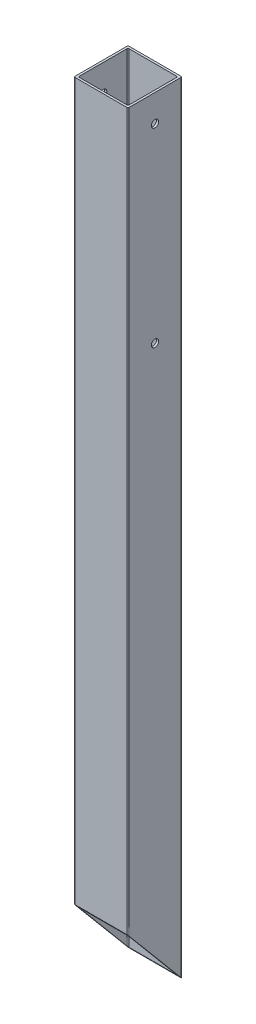
ISO-10303-21;
HEADER;
FILE_DESCRIPTION(('STEP AP214'),'2;1');
FILE_NAME('part.step','',(''),(''),'','','');
FILE_SCHEMA(('AUTOMOTIVE_DESIGN { 1 0 10303 214 1 1 1 1 }'));
ENDSEC;
DATA;
#1=APPLICATION_CONTEXT('core data for automotive mechanical design processes');
#2=APPLICATION_PROTOCOL_DEFINITION('international standard','automotive_design',2000,#1);
#3=PRODUCT_CONTEXT('',#1,'mechanical');
#4=PRODUCT('Part','Part','',(#3));
#5=PRODUCT_RELATED_PRODUCT_CATEGORY('part','',(#4));
#6=PRODUCT_DEFINITION_FORMATION('','',#4);
#7=PRODUCT_DEFINITION_CONTEXT('part definition',#1,'design');
#8=PRODUCT_DEFINITION('design','',#6,#7);
#9=PRODUCT_DEFINITION_SHAPE('','',#8);
#10=(LENGTH_UNIT() NAMED_UNIT(*) SI_UNIT(.MILLI.,.METRE.));
#11=(NAMED_UNIT(*) PLANE_ANGLE_UNIT() SI_UNIT($,.RADIAN.));
#12=(NAMED_UNIT(*) SI_UNIT($,.STERADIAN.) SOLID_ANGLE_UNIT());
#13=UNCERTAINTY_MEASURE_WITH_UNIT(LENGTH_MEASURE(1.E-05),#10,'distance_accuracy_value','');
#14=(GEOMETRIC_REPRESENTATION_CONTEXT(3) GLOBAL_UNCERTAINTY_ASSIGNED_CONTEXT((#13)) GLOBAL_UNIT_ASSIGNED_CONTEXT((#10,
#11,#12)) REPRESENTATION_CONTEXT('',''));
#15=CARTESIAN_POINT('',(0.,0.,0.));
#16=DIRECTION('',(0.,0.,1.));
#17=DIRECTION('',(1.,0.,0.));
#18=AXIS2_PLACEMENT_3D('',#15,#16,#17);
#19=CARTESIAN_POINT('',(2.,1500.,-2.));
#20=DIRECTION('',(0.,1.,0.));
#21=DIRECTION('',(0.,0.,1.));
#22=AXIS2_PLACEMENT_3D('',#19,#20,#21);
#23=PLANE('',#22);
#24=CARTESIAN_POINT('',(2.,1500.,-2.));
#25=DIRECTION('',(0.,1.,0.));
#26=DIRECTION('',(0.,0.,1.));
#27=AXIS2_PLACEMENT_3D('',#24,#25,#26);
#28=CIRCLE('',#27,2.);
#29=CARTESIAN_POINT('',(0.,1500.,-2.00000000000001));
#30=VERTEX_POINT('',#29);
#31=CARTESIAN_POINT('',(2.00000000000001,1500.,0.));
#32=VERTEX_POINT('',#31);
#33=EDGE_CURVE('E257',#30,#32,#28,.T.);
#34=ORIENTED_EDGE('',*,*,#33,.T.);
#35=DIRECTION('',(1.,0.,0.));
#36=VECTOR('',#35,1.);
#37=CARTESIAN_POINT('',(2.00000000000001,1500.,0.));
#38=LINE('',#37,#36);
#39=CARTESIAN_POINT('',(98.,1500.,0.));
#40=VERTEX_POINT('',#39);
#41=EDGE_CURVE('E260',#32,#40,#38,.T.);
#42=ORIENTED_EDGE('',*,*,#41,.T.);
#43=CARTESIAN_POINT('',(98.,1500.,-2.));
#44=DIRECTION('',(0.,1.,0.));
#45=DIRECTION('',(0.,0.,1.));
#46=AXIS2_PLACEMENT_3D('',#43,#44,#45);
#47=CIRCLE('',#46,2.);
#48=CARTESIAN_POINT('',(100.,1500.,-2.00000000000001));
#49=VERTEX_POINT('',#48);
#50=EDGE_CURVE('E262',#40,#49,#47,.T.);
#51=ORIENTED_EDGE('',*,*,#50,.T.);
#52=DIRECTION('',(0.,0.,-1.));
#53=VECTOR('',#52,1.);
#54=CARTESIAN_POINT('',(100.,1500.,-2.00000000000001));
#55=LINE('',#54,#53);
#56=CARTESIAN_POINT('',(100.,1500.,-98.));
#57=VERTEX_POINT('',#56);
#58=EDGE_CURVE('E264',#49,#57,#55,.T.);
#59=ORIENTED_EDGE('',*,*,#58,.T.);
#60=CARTESIAN_POINT('',(98.,1500.,-98.));
#61=DIRECTION('',(0.,1.,0.));
#62=DIRECTION('',(0.,0.,1.));
#63=AXIS2_PLACEMENT_3D('',#60,#61,#62);
#64=CIRCLE('',#63,2.);
#65=CARTESIAN_POINT('',(98.,1500.,-100.));
#66=VERTEX_POINT('',#65);
#67=EDGE_CURVE('E266',#57,#66,#64,.T.);
#68=ORIENTED_EDGE('',*,*,#67,.T.);
#69=DIRECTION('',(-1.,0.,0.));
#70=VECTOR('',#69,1.);
#71=CARTESIAN_POINT('',(2.00000000000001,1500.,-100.));
#72=LINE('',#71,#70);
#73=CARTESIAN_POINT('',(2.00000000000001,1500.,-100.));
#74=VERTEX_POINT('',#73);
#75=EDGE_CURVE('E268',#66,#74,#72,.T.);
#76=ORIENTED_EDGE('',*,*,#75,.T.);
#77=CARTESIAN_POINT('',(2.,1500.,-98.));
#78=DIRECTION('',(0.,1.,0.));
#79=DIRECTION('',(0.,0.,1.));
#80=AXIS2_PLACEMENT_3D('',#77,#78,#79);
#81=CIRCLE('',#80,2.);
#82=CARTESIAN_POINT('',(0.,1500.,-98.));
#83=VERTEX_POINT('',#82);
#84=EDGE_CURVE('E270',#74,#83,#81,.T.);
#85=ORIENTED_EDGE('',*,*,#84,.T.);
#86=DIRECTION('',(0.,0.,1.));
#87=VECTOR('',#86,1.);
#88=CARTESIAN_POINT('',(0.,1500.,-2.00000000000001));
#89=LINE('',#88,#87);
#90=EDGE_CURVE('E166',#83,#30,#89,.T.);
#91=ORIENTED_EDGE('',*,*,#90,.T.);
#92=EDGE_LOOP('',(#34,#42,#51,#59,#68,#76,#85,#91));
#93=FACE_BOUND('',#92,.T.);
#94=DIRECTION('',(0.,0.,1.));
#95=VECTOR('',#94,1.);
#96=CARTESIAN_POINT('',(4.,1500.,-6.00000000000001));
#97=LINE('',#96,#95);
#98=CARTESIAN_POINT('',(4.,1500.,-94.));
#99=VERTEX_POINT('',#98);
#100=CARTESIAN_POINT('',(4.,1500.,-6.00000000000001));
#101=VERTEX_POINT('',#100);
#102=EDGE_CURVE('E218',#99,#101,#97,.T.);
#103=ORIENTED_EDGE('',*,*,#102,.F.);
#104=CARTESIAN_POINT('',(6.,1500.,-94.));
#105=DIRECTION('',(0.,1.,0.));
#106=DIRECTION('',(0.,0.,-1.));
#107=AXIS2_PLACEMENT_3D('',#104,#105,#106);
#108=CIRCLE('',#107,2.);
#109=CARTESIAN_POINT('',(6.00000000000001,1500.,-96.));
#110=VERTEX_POINT('',#109);
#111=EDGE_CURVE('E216',#110,#99,#108,.T.);
#112=ORIENTED_EDGE('',*,*,#111,.F.);
#113=DIRECTION('',(-1.,0.,0.));
#114=VECTOR('',#113,1.);
#115=CARTESIAN_POINT('',(6.00000000000001,1500.,-96.));
#116=LINE('',#115,#114);
#117=CARTESIAN_POINT('',(94.,1500.,-96.));
#118=VERTEX_POINT('',#117);
#119=EDGE_CURVE('E231',#118,#110,#116,.T.);
#120=ORIENTED_EDGE('',*,*,#119,.F.);
#121=CARTESIAN_POINT('',(94.,1500.,-94.));
#122=DIRECTION('',(0.,1.,0.));
#123=DIRECTION('',(0.,0.,1.));
#124=AXIS2_PLACEMENT_3D('',#121,#122,#123);
#125=CIRCLE('',#124,2.);
#126=CARTESIAN_POINT('',(96.,1500.,-94.));
#127=VERTEX_POINT('',#126);
#128=EDGE_CURVE('E228',#127,#118,#125,.T.);
#129=ORIENTED_EDGE('',*,*,#128,.F.);
#130=DIRECTION('',(0.,0.,-1.));
#131=VECTOR('',#130,1.);
#132=CARTESIAN_POINT('',(96.,1500.,-6.00000000000001));
#133=LINE('',#132,#131);
#134=CARTESIAN_POINT('',(96.,1500.,-6.00000000000001));
#135=VERTEX_POINT('',#134);
#136=EDGE_CURVE('E226',#135,#127,#133,.T.);
#137=ORIENTED_EDGE('',*,*,#136,.F.);
#138=CARTESIAN_POINT('',(94.,1500.,-6.));
#139=DIRECTION('',(0.,1.,0.));
#140=DIRECTION('',(0.,0.,-1.));
#141=AXIS2_PLACEMENT_3D('',#138,#139,#140);
#142=CIRCLE('',#141,2.);
#143=CARTESIAN_POINT('',(94.,1500.,-4.));
#144=VERTEX_POINT('',#143);
#145=EDGE_CURVE('E224',#144,#135,#142,.T.);
#146=ORIENTED_EDGE('',*,*,#145,.F.);
#147=DIRECTION('',(1.,0.,0.));
#148=VECTOR('',#147,1.);
#149=CARTESIAN_POINT('',(6.00000000000001,1500.,-4.));
#150=LINE('',#149,#148);
#151=CARTESIAN_POINT('',(6.00000000000001,1500.,-4.));
#152=VERTEX_POINT('',#151);
#153=EDGE_CURVE('E222',#152,#144,#150,.T.);
#154=ORIENTED_EDGE('',*,*,#153,.F.);
#155=CARTESIAN_POINT('',(6.,1500.,-6.));
#156=DIRECTION('',(0.,1.,0.));
#157=DIRECTION('',(0.,0.,-1.));
#158=AXIS2_PLACEMENT_3D('',#155,#156,#157);
#159=CIRCLE('',#158,2.);
#160=EDGE_CURVE('E220',#101,#152,#159,.T.);
#161=ORIENTED_EDGE('',*,*,#160,.F.);
#162=EDGE_LOOP('',(#103,#112,#120,#129,#137,#146,#154,#161));
#163=FACE_BOUND('',#162,.T.);
#164=ADVANCED_FACE('F33',(#93,#163),#23,.T.);
#165=CARTESIAN_POINT('',(2.,1500.,-2.));
#166=DIRECTION('',(0.,-1.,0.));
#167=DIRECTION('',(0.,0.,-1.));
#168=AXIS2_PLACEMENT_3D('',#165,#166,#167);
#169=CYLINDRICAL_SURFACE('',#168,2.);
#170=DIRECTION('',(0.,-1.,0.));
#171=VECTOR('',#170,1.);
#172=CARTESIAN_POINT('',(0.,1500.,-2.00000000000001));
#173=LINE('',#172,#171);
#174=CARTESIAN_POINT('',(0.,171.616492814812,-1.99999999999995));
#175=VERTEX_POINT('',#174);
#176=EDGE_CURVE('E167',#30,#175,#173,.T.);
#177=ORIENTED_EDGE('',*,*,#176,.T.);
#178=CARTESIAN_POINT('',(2.,171.616492814812,-2.));
#179=DIRECTION('',(0.,0.64278760968654,-0.766044443118977));
#180=DIRECTION('',(0.,-0.766044443118977,-0.64278760968654));
#181=AXIS2_PLACEMENT_3D('',#178,#179,#180);
#182=ELLIPSE('',#181,3.11144765372082,2.);
#183=CARTESIAN_POINT('',(2.00000000000002,174.,0.));
#184=VERTEX_POINT('',#183);
#185=EDGE_CURVE('E48',#175,#184,#182,.T.);
#186=ORIENTED_EDGE('',*,*,#185,.T.);
#187=DIRECTION('',(0.,-1.,0.));
#188=VECTOR('',#187,1.);
#189=CARTESIAN_POINT('',(2.00000000000001,1500.,0.));
#190=LINE('',#189,#188);
#191=EDGE_CURVE('E41',#32,#184,#190,.T.);
#192=ORIENTED_EDGE('',*,*,#191,.F.);
#193=ORIENTED_EDGE('',*,*,#33,.F.);
#194=EDGE_LOOP('',(#177,#186,#192,#193));
#195=FACE_BOUND('',#194,.T.);
#196=ADVANCED_FACE('F35',(#195),#169,.T.);
#197=CARTESIAN_POINT('',(2.00000000000001,1500.,0.));
#198=DIRECTION('',(0.,0.,-1.));
#199=DIRECTION('',(-1.,0.,0.));
#200=AXIS2_PLACEMENT_3D('',#197,#198,#199);
#201=PLANE('',#200);
#202=ORIENTED_EDGE('',*,*,#191,.T.);
#203=DIRECTION('',(-1.,0.,0.));
#204=VECTOR('',#203,1.);
#205=CARTESIAN_POINT('',(100.,174.,0.));
#206=LINE('',#205,#204);
#207=CARTESIAN_POINT('',(98.,174.,0.));
#208=VERTEX_POINT('',#207);
#209=EDGE_CURVE('E280',#208,#184,#206,.T.);
#210=ORIENTED_EDGE('',*,*,#209,.F.);
#211=DIRECTION('',(0.,-1.,0.));
#212=VECTOR('',#211,1.);
#213=CARTESIAN_POINT('',(98.,1500.,0.));
#214=LINE('',#213,#212);
#215=EDGE_CURVE('E182',#40,#208,#214,.T.);
#216=ORIENTED_EDGE('',*,*,#215,.F.);
#217=ORIENTED_EDGE('',*,*,#41,.F.);
#218=EDGE_LOOP('',(#202,#210,#216,#217));
#219=FACE_BOUND('',#218,.T.);
#220=ADVANCED_FACE('F278',(#219),#201,.F.);
#221=CARTESIAN_POINT('',(98.,1500.,-2.));
#222=DIRECTION('',(0.,-1.,0.));
#223=DIRECTION('',(0.,0.,-1.));
#224=AXIS2_PLACEMENT_3D('',#221,#222,#223);
#225=CYLINDRICAL_SURFACE('',#224,2.);
#226=ORIENTED_EDGE('',*,*,#215,.T.);
#227=CARTESIAN_POINT('',(98.,171.616492814812,-2.));
#228=DIRECTION('',(0.,0.64278760968654,-0.766044443118977));
#229=DIRECTION('',(0.,-0.766044443118977,-0.64278760968654));
#230=AXIS2_PLACEMENT_3D('',#227,#228,#229);
#231=ELLIPSE('',#230,3.11144765372082,2.);
#232=CARTESIAN_POINT('',(100.,171.616492814812,-1.99999999999991));
#233=VERTEX_POINT('',#232);
#234=EDGE_CURVE('E288',#208,#233,#231,.T.);
#235=ORIENTED_EDGE('',*,*,#234,.T.);
#236=DIRECTION('',(0.,-1.,0.));
#237=VECTOR('',#236,1.);
#238=CARTESIAN_POINT('',(100.,1500.,-2.00000000000001));
#239=LINE('',#238,#237);
#240=EDGE_CURVE('E179',#49,#233,#239,.T.);
#241=ORIENTED_EDGE('',*,*,#240,.F.);
#242=ORIENTED_EDGE('',*,*,#50,.F.);
#243=EDGE_LOOP('',(#226,#235,#241,#242));
#244=FACE_BOUND('',#243,.T.);
#245=ADVANCED_FACE('F287',(#244),#225,.T.);
#246=CARTESIAN_POINT('',(100.,1500.,-2.00000000000001));
#247=DIRECTION('',(-1.,0.,0.));
#248=DIRECTION('',(0.,0.,1.));
#249=AXIS2_PLACEMENT_3D('',#246,#247,#248);
#250=PLANE('',#249);
#251=CARTESIAN_POINT('',(100.,1098.,-50.));
#252=DIRECTION('',(-1.,0.,0.));
#253=DIRECTION('',(0.,0.,1.));
#254=AXIS2_PLACEMENT_3D('',#251,#252,#253);
#255=CIRCLE('',#254,6.74999999999992);
#256=CARTESIAN_POINT('',(100.,1098.,-43.2500000000001));
#257=VERTEX_POINT('',#256);
#258=EDGE_CURVE('E194',#257,#257,#255,.T.);
#259=ORIENTED_EDGE('',*,*,#258,.T.);
#260=EDGE_LOOP('',(#259));
#261=FACE_BOUND('',#260,.T.);
#262=CARTESIAN_POINT('',(100.,1450.,-50.0000000000001));
#263=DIRECTION('',(-1.,0.,0.));
#264=DIRECTION('',(0.,0.,1.));
#265=AXIS2_PLACEMENT_3D('',#262,#263,#264);
#266=CIRCLE('',#265,6.74999999999993);
#267=CARTESIAN_POINT('',(100.,1450.,-43.2500000000001));
#268=VERTEX_POINT('',#267);
#269=EDGE_CURVE('E190',#268,#268,#266,.T.);
#270=ORIENTED_EDGE('',*,*,#269,.T.);
#271=EDGE_LOOP('',(#270));
#272=FACE_BOUND('',#271,.T.);
#273=ORIENTED_EDGE('',*,*,#240,.T.);
#274=DIRECTION('',(0.,-0.766044443118977,-0.64278760968654));
#275=VECTOR('',#274,1.);
#276=CARTESIAN_POINT('',(100.,174.,0.));
#277=LINE('',#276,#275);
#278=CARTESIAN_POINT('',(100.,57.2081479257678,-98.));
#279=VERTEX_POINT('',#278);
#280=EDGE_CURVE('E151',#233,#279,#277,.T.);
#281=ORIENTED_EDGE('',*,*,#280,.T.);
#282=DIRECTION('',(0.,-1.,0.));
#283=VECTOR('',#282,1.);
#284=CARTESIAN_POINT('',(100.,1500.,-98.));
#285=LINE('',#284,#283);
#286=EDGE_CURVE('E176',#57,#279,#285,.T.);
#287=ORIENTED_EDGE('',*,*,#286,.F.);
#288=ORIENTED_EDGE('',*,*,#58,.F.);
#289=EDGE_LOOP('',(#273,#281,#287,#288));
#290=FACE_BOUND('',#289,.T.);
#291=ADVANCED_FACE('F291',(#261,#272,#290),#250,.F.);
#292=CARTESIAN_POINT('',(98.,1500.,-98.));
#293=DIRECTION('',(0.,-1.,0.));
#294=DIRECTION('',(0.,0.,-1.));
#295=AXIS2_PLACEMENT_3D('',#292,#293,#294);
#296=CYLINDRICAL_SURFACE('',#295,2.);
#297=ORIENTED_EDGE('',*,*,#286,.T.);
#298=CARTESIAN_POINT('',(98.,57.2081479257676,-98.));
#299=DIRECTION('',(0.,0.64278760968654,-0.766044443118977));
#300=DIRECTION('',(0.,-0.766044443118977,-0.64278760968654));
#301=AXIS2_PLACEMENT_3D('',#298,#299,#300);
#302=ELLIPSE('',#301,3.11144765372082,2.);
#303=CARTESIAN_POINT('',(98.,54.8246407405792,-100.));
#304=VERTEX_POINT('',#303);
#305=EDGE_CURVE('E300',#279,#304,#302,.T.);
#306=ORIENTED_EDGE('',*,*,#305,.T.);
#307=DIRECTION('',(0.,-1.,0.));
#308=VECTOR('',#307,1.);
#309=CARTESIAN_POINT('',(98.,1500.,-100.));
#310=LINE('',#309,#308);
#311=EDGE_CURVE('E169',#66,#304,#310,.T.);
#312=ORIENTED_EDGE('',*,*,#311,.F.);
#313=ORIENTED_EDGE('',*,*,#67,.F.);
#314=EDGE_LOOP('',(#297,#306,#312,#313));
#315=FACE_BOUND('',#314,.T.);
#316=ADVANCED_FACE('F296',(#315),#296,.T.);
#317=CARTESIAN_POINT('',(2.00000000000001,1500.,-100.));
#318=DIRECTION('',(0.,0.,1.));
#319=DIRECTION('',(1.,0.,0.));
#320=AXIS2_PLACEMENT_3D('',#317,#318,#319);
#321=PLANE('',#320);
#322=ORIENTED_EDGE('',*,*,#311,.T.);
#323=DIRECTION('',(-1.,0.,0.));
#324=VECTOR('',#323,1.);
#325=CARTESIAN_POINT('',(2.00000000000001,54.8246407405792,-100.));
#326=LINE('',#325,#324);
#327=CARTESIAN_POINT('',(2.00000000000001,54.8246407405792,-100.));
#328=VERTEX_POINT('',#327);
#329=EDGE_CURVE('E162',#304,#328,#326,.T.);
#330=ORIENTED_EDGE('',*,*,#329,.T.);
#331=DIRECTION('',(0.,-1.,0.));
#332=VECTOR('',#331,1.);
#333=CARTESIAN_POINT('',(2.00000000000001,1500.,-100.));
#334=LINE('',#333,#332);
#335=EDGE_CURVE('E161',#74,#328,#334,.T.);
#336=ORIENTED_EDGE('',*,*,#335,.F.);
#337=ORIENTED_EDGE('',*,*,#75,.F.);
#338=EDGE_LOOP('',(#322,#330,#336,#337));
#339=FACE_BOUND('',#338,.T.);
#340=ADVANCED_FACE('F299',(#339),#321,.F.);
#341=CARTESIAN_POINT('',(2.,1500.,-98.));
#342=DIRECTION('',(0.,-1.,0.));
#343=DIRECTION('',(0.,0.,-1.));
#344=AXIS2_PLACEMENT_3D('',#341,#342,#343);
#345=CYLINDRICAL_SURFACE('',#344,2.);
#346=ORIENTED_EDGE('',*,*,#335,.T.);
#347=CARTESIAN_POINT('',(2.,57.2081479257676,-98.));
#348=DIRECTION('',(0.,0.64278760968654,-0.766044443118977));
#349=DIRECTION('',(0.,-0.766044443118977,-0.64278760968654));
#350=AXIS2_PLACEMENT_3D('',#347,#348,#349);
#351=ELLIPSE('',#350,3.11144765372082,2.);
#352=CARTESIAN_POINT('',(0.,57.2081479257675,-98.0000000000002));
#353=VERTEX_POINT('',#352);
#354=EDGE_CURVE('E145',#328,#353,#351,.T.);
#355=ORIENTED_EDGE('',*,*,#354,.T.);
#356=DIRECTION('',(0.,-1.,0.));
#357=VECTOR('',#356,1.);
#358=CARTESIAN_POINT('',(0.,1500.,-98.));
#359=LINE('',#358,#357);
#360=EDGE_CURVE('E158',#83,#353,#359,.T.);
#361=ORIENTED_EDGE('',*,*,#360,.F.);
#362=ORIENTED_EDGE('',*,*,#84,.F.);
#363=EDGE_LOOP('',(#346,#355,#361,#362));
#364=FACE_BOUND('',#363,.T.);
#365=ADVANCED_FACE('F156',(#364),#345,.T.);
#366=CARTESIAN_POINT('',(0.,1500.,-2.00000000000001));
#367=DIRECTION('',(1.,0.,0.));
#368=DIRECTION('',(0.,0.,-1.));
#369=AXIS2_PLACEMENT_3D('',#366,#367,#368);
#370=PLANE('',#369);
#371=CARTESIAN_POINT('',(0.,1098.,-50.));
#372=DIRECTION('',(-1.,0.,0.));
#373=DIRECTION('',(0.,0.,1.));
#374=AXIS2_PLACEMENT_3D('',#371,#372,#373);
#375=CIRCLE('',#374,6.74999999999992);
#376=CARTESIAN_POINT('',(0.,1098.,-43.2500000000001));
#377=VERTEX_POINT('',#376);
#378=EDGE_CURVE('E201',#377,#377,#375,.T.);
#379=ORIENTED_EDGE('',*,*,#378,.F.);
#380=EDGE_LOOP('',(#379));
#381=FACE_BOUND('',#380,.T.);
#382=CARTESIAN_POINT('',(0.,1450.,-50.0000000000001));
#383=DIRECTION('',(-1.,0.,0.));
#384=DIRECTION('',(0.,0.,1.));
#385=AXIS2_PLACEMENT_3D('',#382,#383,#384);
#386=CIRCLE('',#385,6.74999999999993);
#387=CARTESIAN_POINT('',(0.,1450.,-43.2500000000001));
#388=VERTEX_POINT('',#387);
#389=EDGE_CURVE('E198',#388,#388,#386,.T.);
#390=ORIENTED_EDGE('',*,*,#389,.F.);
#391=EDGE_LOOP('',(#390));
#392=FACE_BOUND('',#391,.T.);
#393=ORIENTED_EDGE('',*,*,#360,.T.);
#394=DIRECTION('',(0.,-0.766044443118977,-0.64278760968654));
#395=VECTOR('',#394,1.);
#396=CARTESIAN_POINT('',(0.,174.,0.));
#397=LINE('',#396,#395);
#398=EDGE_CURVE('E142',#175,#353,#397,.T.);
#399=ORIENTED_EDGE('',*,*,#398,.F.);
#400=ORIENTED_EDGE('',*,*,#176,.F.);
#401=ORIENTED_EDGE('',*,*,#90,.F.);
#402=EDGE_LOOP('',(#393,#399,#400,#401));
#403=FACE_BOUND('',#402,.T.);
#404=ADVANCED_FACE('F165',(#381,#392,#403),#370,.F.);
#405=CARTESIAN_POINT('',(6.,1500.,-94.));
#406=DIRECTION('',(0.,-1.,0.));
#407=DIRECTION('',(0.,0.,-1.));
#408=AXIS2_PLACEMENT_3D('',#405,#406,#407);
#409=CYLINDRICAL_SURFACE('',#408,2.);
#410=CARTESIAN_POINT('',(6.,61.9751622961444,-94.));
#411=DIRECTION('',(0.,0.64278760968654,-0.766044443118977));
#412=DIRECTION('',(0.,-0.766044443118977,-0.64278760968654));
#413=AXIS2_PLACEMENT_3D('',#410,#411,#412);
#414=ELLIPSE('',#413,3.11144765372082,2.);
#415=CARTESIAN_POINT('',(6.00000000000001,59.5916551109561,-96.));
#416=VERTEX_POINT('',#415);
#417=CARTESIAN_POINT('',(4.,61.9751622961444,-94.0000000000001));
#418=VERTEX_POINT('',#417);
#419=EDGE_CURVE('E163',#416,#418,#414,.T.);
#420=ORIENTED_EDGE('',*,*,#419,.F.);
#421=DIRECTION('',(0.,-1.,0.));
#422=VECTOR('',#421,1.);
#423=CARTESIAN_POINT('',(6.00000000000001,1500.,-96.));
#424=LINE('',#423,#422);
#425=EDGE_CURVE('E233',#110,#416,#424,.T.);
#426=ORIENTED_EDGE('',*,*,#425,.F.);
#427=ORIENTED_EDGE('',*,*,#111,.T.);
#428=DIRECTION('',(0.,-1.,0.));
#429=VECTOR('',#428,1.);
#430=CARTESIAN_POINT('',(4.,1500.,-94.));
#431=LINE('',#430,#429);
#432=EDGE_CURVE('E254',#99,#418,#431,.T.);
#433=ORIENTED_EDGE('',*,*,#432,.T.);
#434=EDGE_LOOP('',(#420,#426,#427,#433));
#435=FACE_BOUND('',#434,.T.);
#436=ADVANCED_FACE('F338',(#435),#409,.F.);
#437=CARTESIAN_POINT('',(4.,1500.,-6.00000000000001));
#438=DIRECTION('',(1.,0.,0.));
#439=DIRECTION('',(0.,0.,-1.));
#440=AXIS2_PLACEMENT_3D('',#437,#438,#439);
#441=PLANE('',#440);
#442=DIRECTION('',(0.,0.766044443118977,0.64278760968654));
#443=VECTOR('',#442,1.);
#444=CARTESIAN_POINT('',(4.,949.174318534136,650.448484780095));
#445=LINE('',#444,#443);
#446=CARTESIAN_POINT('',(4.,166.849478444435,-6.00000000000001));
#447=VERTEX_POINT('',#446);
#448=EDGE_CURVE('E305',#418,#447,#445,.T.);
#449=ORIENTED_EDGE('',*,*,#448,.F.);
#450=ORIENTED_EDGE('',*,*,#432,.F.);
#451=ORIENTED_EDGE('',*,*,#102,.T.);
#452=DIRECTION('',(0.,-1.,0.));
#453=VECTOR('',#452,1.);
#454=CARTESIAN_POINT('',(4.,1500.,-6.00000000000001));
#455=LINE('',#454,#453);
#456=EDGE_CURVE('E251',#101,#447,#455,.T.);
#457=ORIENTED_EDGE('',*,*,#456,.T.);
#458=EDGE_LOOP('',(#449,#450,#451,#457));
#459=FACE_BOUND('',#458,.T.);
#460=CARTESIAN_POINT('',(4.,1098.,-50.));
#461=DIRECTION('',(1.,0.,0.));
#462=DIRECTION('',(0.,0.,-1.));
#463=AXIS2_PLACEMENT_3D('',#460,#461,#462);
#464=CIRCLE('',#463,6.74999999999992);
#465=CARTESIAN_POINT('',(4.,1098.,-56.7499999999999));
#466=VERTEX_POINT('',#465);
#467=EDGE_CURVE('E193',#466,#466,#464,.T.);
#468=ORIENTED_EDGE('',*,*,#467,.F.);
#469=EDGE_LOOP('',(#468));
#470=FACE_BOUND('',#469,.T.);
#471=CARTESIAN_POINT('',(4.,1450.,-50.0000000000001));
#472=DIRECTION('',(1.,0.,0.));
#473=DIRECTION('',(0.,0.,-1.));
#474=AXIS2_PLACEMENT_3D('',#471,#472,#473);
#475=CIRCLE('',#474,6.74999999999993);
#476=CARTESIAN_POINT('',(4.,1450.,-56.75));
#477=VERTEX_POINT('',#476);
#478=EDGE_CURVE('E189',#477,#477,#475,.T.);
#479=ORIENTED_EDGE('',*,*,#478,.F.);
#480=EDGE_LOOP('',(#479));
#481=FACE_BOUND('',#480,.T.);
#482=ADVANCED_FACE('F343',(#459,#470,#481),#441,.T.);
#483=CARTESIAN_POINT('',(6.,1500.,-6.));
#484=DIRECTION('',(0.,-1.,0.));
#485=DIRECTION('',(0.,0.,-1.));
#486=AXIS2_PLACEMENT_3D('',#483,#484,#485);
#487=CYLINDRICAL_SURFACE('',#486,2.);
#488=CARTESIAN_POINT('',(6.,166.849478444435,-6.));
#489=DIRECTION('',(0.,0.64278760968654,-0.766044443118977));
#490=DIRECTION('',(0.,-0.766044443118977,-0.64278760968654));
#491=AXIS2_PLACEMENT_3D('',#488,#489,#490);
#492=ELLIPSE('',#491,3.11144765372082,2.);
#493=CARTESIAN_POINT('',(6.00000000000001,169.232985629623,-4.));
#494=VERTEX_POINT('',#493);
#495=EDGE_CURVE('E307',#447,#494,#492,.T.);
#496=ORIENTED_EDGE('',*,*,#495,.F.);
#497=ORIENTED_EDGE('',*,*,#456,.F.);
#498=ORIENTED_EDGE('',*,*,#160,.T.);
#499=DIRECTION('',(0.,-1.,0.));
#500=VECTOR('',#499,1.);
#501=CARTESIAN_POINT('',(6.00000000000001,1500.,-4.));
#502=LINE('',#501,#500);
#503=EDGE_CURVE('E248',#152,#494,#502,.T.);
#504=ORIENTED_EDGE('',*,*,#503,.T.);
#505=EDGE_LOOP('',(#496,#497,#498,#504));
#506=FACE_BOUND('',#505,.T.);
#507=ADVANCED_FACE('F348',(#506),#487,.F.);
#508=CARTESIAN_POINT('',(6.00000000000001,1500.,-4.));
#509=DIRECTION('',(0.,0.,-1.));
#510=DIRECTION('',(-1.,0.,0.));
#511=AXIS2_PLACEMENT_3D('',#508,#509,#510);
#512=PLANE('',#511);
#513=DIRECTION('',(1.,0.,0.));
#514=VECTOR('',#513,1.);
#515=CARTESIAN_POINT('',(6.00000000000001,169.232985629623,-4.));
#516=LINE('',#515,#514);
#517=CARTESIAN_POINT('',(94.,169.232985629623,-4.));
#518=VERTEX_POINT('',#517);
#519=EDGE_CURVE('E309',#494,#518,#516,.T.);
#520=ORIENTED_EDGE('',*,*,#519,.F.);
#521=ORIENTED_EDGE('',*,*,#503,.F.);
#522=ORIENTED_EDGE('',*,*,#153,.T.);
#523=DIRECTION('',(0.,-1.,0.));
#524=VECTOR('',#523,1.);
#525=CARTESIAN_POINT('',(94.,1500.,-4.));
#526=LINE('',#525,#524);
#527=EDGE_CURVE('E245',#144,#518,#526,.T.);
#528=ORIENTED_EDGE('',*,*,#527,.T.);
#529=EDGE_LOOP('',(#520,#521,#522,#528));
#530=FACE_BOUND('',#529,.T.);
#531=ADVANCED_FACE('F353',(#530),#512,.T.);
#532=CARTESIAN_POINT('',(94.,1500.,-6.));
#533=DIRECTION('',(0.,-1.,0.));
#534=DIRECTION('',(0.,0.,-1.));
#535=AXIS2_PLACEMENT_3D('',#532,#533,#534);
#536=CYLINDRICAL_SURFACE('',#535,2.);
#537=CARTESIAN_POINT('',(94.,166.849478444435,-6.));
#538=DIRECTION('',(0.,0.64278760968654,-0.766044443118977));
#539=DIRECTION('',(0.,-0.766044443118977,-0.64278760968654));
#540=AXIS2_PLACEMENT_3D('',#537,#538,#539);
#541=ELLIPSE('',#540,3.11144765372082,2.);
#542=CARTESIAN_POINT('',(96.,166.849478444435,-5.99999999999989));
#543=VERTEX_POINT('',#542);
#544=EDGE_CURVE('E311',#518,#543,#541,.T.);
#545=ORIENTED_EDGE('',*,*,#544,.F.);
#546=ORIENTED_EDGE('',*,*,#527,.F.);
#547=ORIENTED_EDGE('',*,*,#145,.T.);
#548=DIRECTION('',(0.,-1.,0.));
#549=VECTOR('',#548,1.);
#550=CARTESIAN_POINT('',(96.,1500.,-6.00000000000001));
#551=LINE('',#550,#549);
#552=EDGE_CURVE('E242',#135,#543,#551,.T.);
#553=ORIENTED_EDGE('',*,*,#552,.T.);
#554=EDGE_LOOP('',(#545,#546,#547,#553));
#555=FACE_BOUND('',#554,.T.);
#556=ADVANCED_FACE('F355',(#555),#536,.F.);
#557=CARTESIAN_POINT('',(96.,1500.,-6.00000000000001));
#558=DIRECTION('',(-1.,0.,0.));
#559=DIRECTION('',(0.,0.,1.));
#560=AXIS2_PLACEMENT_3D('',#557,#558,#559);
#561=PLANE('',#560);
#562=DIRECTION('',(0.,-0.766044443118977,-0.64278760968654));
#563=VECTOR('',#562,1.);
#564=CARTESIAN_POINT('',(96.,949.174318534136,650.448484780095));
#565=LINE('',#564,#563);
#566=CARTESIAN_POINT('',(96.,61.9751622961444,-94.));
#567=VERTEX_POINT('',#566);
#568=EDGE_CURVE('E313',#543,#567,#565,.T.);
#569=ORIENTED_EDGE('',*,*,#568,.F.);
#570=ORIENTED_EDGE('',*,*,#552,.F.);
#571=ORIENTED_EDGE('',*,*,#136,.T.);
#572=DIRECTION('',(0.,-1.,0.));
#573=VECTOR('',#572,1.);
#574=CARTESIAN_POINT('',(96.,1500.,-94.));
#575=LINE('',#574,#573);
#576=EDGE_CURVE('E239',#127,#567,#575,.T.);
#577=ORIENTED_EDGE('',*,*,#576,.T.);
#578=EDGE_LOOP('',(#569,#570,#571,#577));
#579=FACE_BOUND('',#578,.T.);
#580=CARTESIAN_POINT('',(96.,1098.,-50.));
#581=DIRECTION('',(-1.,0.,0.));
#582=DIRECTION('',(0.,0.,1.));
#583=AXIS2_PLACEMENT_3D('',#580,#581,#582);
#584=CIRCLE('',#583,6.74999999999992);
#585=CARTESIAN_POINT('',(96.,1098.,-43.2500000000001));
#586=VERTEX_POINT('',#585);
#587=EDGE_CURVE('E191',#586,#586,#584,.T.);
#588=ORIENTED_EDGE('',*,*,#587,.F.);
#589=EDGE_LOOP('',(#588));
#590=FACE_BOUND('',#589,.T.);
#591=CARTESIAN_POINT('',(96.,1450.,-50.0000000000001));
#592=DIRECTION('',(-1.,0.,0.));
#593=DIRECTION('',(0.,0.,1.));
#594=AXIS2_PLACEMENT_3D('',#591,#592,#593);
#595=CIRCLE('',#594,6.74999999999993);
#596=CARTESIAN_POINT('',(96.,1450.,-43.2500000000001));
#597=VERTEX_POINT('',#596);
#598=EDGE_CURVE('E187',#597,#597,#595,.T.);
#599=ORIENTED_EDGE('',*,*,#598,.F.);
#600=EDGE_LOOP('',(#599));
#601=FACE_BOUND('',#600,.T.);
#602=ADVANCED_FACE('F325',(#579,#590,#601),#561,.T.);
#603=CARTESIAN_POINT('',(94.,1500.,-94.));
#604=DIRECTION('',(0.,-1.,0.));
#605=DIRECTION('',(0.,0.,-1.));
#606=AXIS2_PLACEMENT_3D('',#603,#604,#605);
#607=CYLINDRICAL_SURFACE('',#606,2.);
#608=CARTESIAN_POINT('',(94.,61.9751622961444,-94.));
#609=DIRECTION('',(0.,0.64278760968654,-0.766044443118977));
#610=DIRECTION('',(0.,-0.766044443118977,-0.64278760968654));
#611=AXIS2_PLACEMENT_3D('',#608,#609,#610);
#612=ELLIPSE('',#611,3.11144765372082,2.);
#613=CARTESIAN_POINT('',(94.,59.5916551109561,-96.));
#614=VERTEX_POINT('',#613);
#615=EDGE_CURVE('E55',#567,#614,#612,.T.);
#616=ORIENTED_EDGE('',*,*,#615,.F.);
#617=ORIENTED_EDGE('',*,*,#576,.F.);
#618=ORIENTED_EDGE('',*,*,#128,.T.);
#619=DIRECTION('',(0.,-1.,0.));
#620=VECTOR('',#619,1.);
#621=CARTESIAN_POINT('',(94.,1500.,-96.));
#622=LINE('',#621,#620);
#623=EDGE_CURVE('E236',#118,#614,#622,.T.);
#624=ORIENTED_EDGE('',*,*,#623,.T.);
#625=EDGE_LOOP('',(#616,#617,#618,#624));
#626=FACE_BOUND('',#625,.T.);
#627=ADVANCED_FACE('F323',(#626),#607,.F.);
#628=CARTESIAN_POINT('',(6.00000000000001,1500.,-96.));
#629=DIRECTION('',(0.,0.,1.));
#630=DIRECTION('',(1.,0.,0.));
#631=AXIS2_PLACEMENT_3D('',#628,#629,#630);
#632=PLANE('',#631);
#633=DIRECTION('',(-1.,0.,0.));
#634=VECTOR('',#633,1.);
#635=CARTESIAN_POINT('',(6.00000000000001,59.5916551109561,-96.));
#636=LINE('',#635,#634);
#637=EDGE_CURVE('E11',#614,#416,#636,.T.);
#638=ORIENTED_EDGE('',*,*,#637,.F.);
#639=ORIENTED_EDGE('',*,*,#623,.F.);
#640=ORIENTED_EDGE('',*,*,#119,.T.);
#641=ORIENTED_EDGE('',*,*,#425,.T.);
#642=EDGE_LOOP('',(#638,#639,#640,#641));
#643=FACE_BOUND('',#642,.T.);
#644=ADVANCED_FACE('F335',(#643),#632,.T.);
#645=CARTESIAN_POINT('',(100.,1450.,-50.0000000000001));
#646=DIRECTION('',(-1.,0.,0.));
#647=DIRECTION('',(0.,0.,1.));
#648=AXIS2_PLACEMENT_3D('',#645,#646,#647);
#649=CYLINDRICAL_SURFACE('',#648,6.74999999999993);
#650=ORIENTED_EDGE('',*,*,#598,.T.);
#651=EDGE_LOOP('',(#650));
#652=FACE_BOUND('',#651,.T.);
#653=ORIENTED_EDGE('',*,*,#269,.F.);
#654=EDGE_LOOP('',(#653));
#655=FACE_BOUND('',#654,.T.);
#656=ADVANCED_FACE('F460',(#652,#655),#649,.F.);
#657=ORIENTED_EDGE('',*,*,#478,.T.);
#658=EDGE_LOOP('',(#657));
#659=FACE_BOUND('',#658,.T.);
#660=ORIENTED_EDGE('',*,*,#389,.T.);
#661=EDGE_LOOP('',(#660));
#662=FACE_BOUND('',#661,.T.);
#663=ADVANCED_FACE('F469',(#659,#662),#649,.F.);
#664=CARTESIAN_POINT('',(100.,1098.,-50.));
#665=DIRECTION('',(-1.,0.,0.));
#666=DIRECTION('',(0.,0.,1.));
#667=AXIS2_PLACEMENT_3D('',#664,#665,#666);
#668=CYLINDRICAL_SURFACE('',#667,6.74999999999992);
#669=ORIENTED_EDGE('',*,*,#587,.T.);
#670=EDGE_LOOP('',(#669));
#671=FACE_BOUND('',#670,.T.);
#672=ORIENTED_EDGE('',*,*,#258,.F.);
#673=EDGE_LOOP('',(#672));
#674=FACE_BOUND('',#673,.T.);
#675=ADVANCED_FACE('F479',(#671,#674),#668,.F.);
#676=ORIENTED_EDGE('',*,*,#467,.T.);
#677=EDGE_LOOP('',(#676));
#678=FACE_BOUND('',#677,.T.);
#679=ORIENTED_EDGE('',*,*,#378,.T.);
#680=EDGE_LOOP('',(#679));
#681=FACE_BOUND('',#680,.T.);
#682=ADVANCED_FACE('F488',(#678,#681),#668,.F.);
#683=CARTESIAN_POINT('',(100.,174.,0.));
#684=DIRECTION('',(0.,0.64278760968654,-0.766044443118977));
#685=DIRECTION('',(0.,0.766044443118977,0.64278760968654));
#686=AXIS2_PLACEMENT_3D('',#683,#684,#685);
#687=PLANE('',#686);
#688=ORIENTED_EDGE('',*,*,#419,.T.);
#689=ORIENTED_EDGE('',*,*,#448,.T.);
#690=ORIENTED_EDGE('',*,*,#495,.T.);
#691=ORIENTED_EDGE('',*,*,#519,.T.);
#692=ORIENTED_EDGE('',*,*,#544,.T.);
#693=ORIENTED_EDGE('',*,*,#568,.T.);
#694=ORIENTED_EDGE('',*,*,#615,.T.);
#695=ORIENTED_EDGE('',*,*,#637,.T.);
#696=EDGE_LOOP('',(#688,#689,#690,#691,#692,#693,#694,#695));
#697=FACE_BOUND('',#696,.T.);
#698=ORIENTED_EDGE('',*,*,#398,.T.);
#699=ORIENTED_EDGE('',*,*,#354,.F.);
#700=ORIENTED_EDGE('',*,*,#329,.F.);
#701=ORIENTED_EDGE('',*,*,#305,.F.);
#702=ORIENTED_EDGE('',*,*,#280,.F.);
#703=ORIENTED_EDGE('',*,*,#234,.F.);
#704=ORIENTED_EDGE('',*,*,#209,.T.);
#705=ORIENTED_EDGE('',*,*,#185,.F.);
#706=EDGE_LOOP('',(#698,#699,#700,#701,#702,#703,#704,#705));
#707=FACE_BOUND('',#706,.T.);
#708=ADVANCED_FACE('F144',(#697,#707),#687,.F.);
#709=CLOSED_SHELL('',(#164,#196,#220,#245,#291,#316,#340,#365,#404,#436,#482,#507,#531,#556,
#602,#627,#644,#656,#663,#675,#682,#708));
#710=MANIFOLD_SOLID_BREP('B2',#709);
#711=ADVANCED_BREP_SHAPE_REPRESENTATION('',(#18,#710),#14);
#712=SHAPE_DEFINITION_REPRESENTATION(#9,#711);
ENDSEC;
END-ISO-10303-21;
